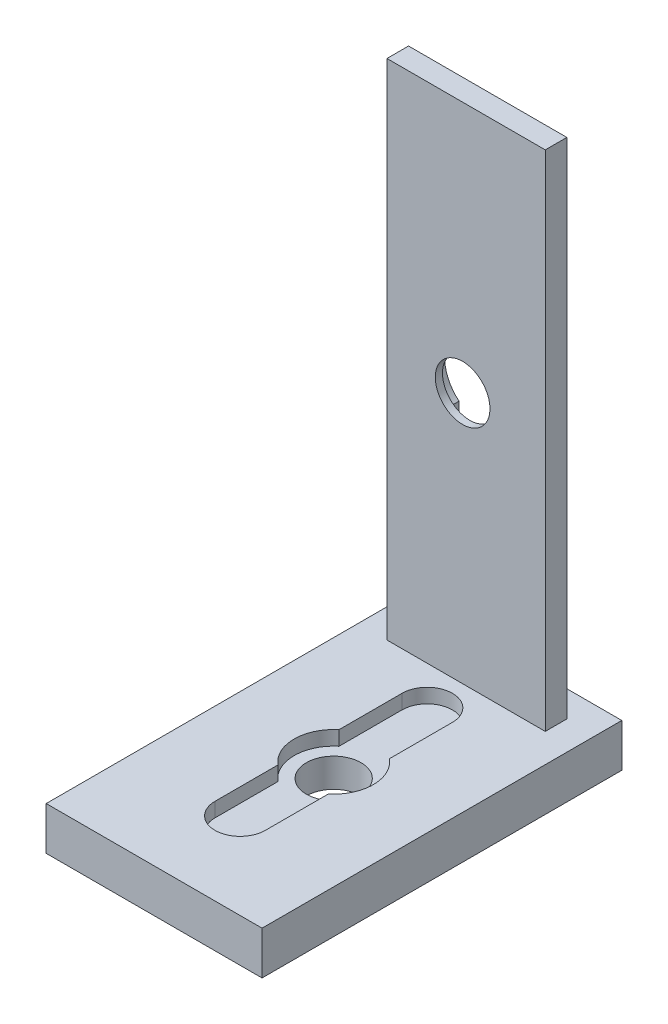
ISO-10303-21;
HEADER;
FILE_DESCRIPTION(('STEP AP214'),'2;1');
FILE_NAME('part.step','',(''),(''),'','','');
FILE_SCHEMA(('AUTOMOTIVE_DESIGN { 1 0 10303 214 1 1 1 1 }'));
ENDSEC;
DATA;
#1=APPLICATION_CONTEXT('core data for automotive mechanical design processes');
#2=APPLICATION_PROTOCOL_DEFINITION('international standard','automotive_design',2000,#1);
#3=PRODUCT_CONTEXT('',#1,'mechanical');
#4=PRODUCT('Part','Part','',(#3));
#5=PRODUCT_RELATED_PRODUCT_CATEGORY('part','',(#4));
#6=PRODUCT_DEFINITION_FORMATION('','',#4);
#7=PRODUCT_DEFINITION_CONTEXT('part definition',#1,'design');
#8=PRODUCT_DEFINITION('design','',#6,#7);
#9=PRODUCT_DEFINITION_SHAPE('','',#8);
#10=(LENGTH_UNIT() NAMED_UNIT(*) SI_UNIT(.MILLI.,.METRE.));
#11=(NAMED_UNIT(*) PLANE_ANGLE_UNIT() SI_UNIT($,.RADIAN.));
#12=(NAMED_UNIT(*) SI_UNIT($,.STERADIAN.) SOLID_ANGLE_UNIT());
#13=UNCERTAINTY_MEASURE_WITH_UNIT(LENGTH_MEASURE(1.E-05),#10,'distance_accuracy_value','');
#14=(GEOMETRIC_REPRESENTATION_CONTEXT(3) GLOBAL_UNCERTAINTY_ASSIGNED_CONTEXT((#13)) GLOBAL_UNIT_ASSIGNED_CONTEXT((#10,
#11,#12)) REPRESENTATION_CONTEXT('',''));
#15=CARTESIAN_POINT('',(0.,0.,0.));
#16=DIRECTION('',(0.,0.,1.));
#17=DIRECTION('',(1.,0.,0.));
#18=AXIS2_PLACEMENT_3D('',#15,#16,#17);
#19=CARTESIAN_POINT('',(0.,3.,0.));
#20=DIRECTION('',(0.,1.,0.));
#21=DIRECTION('',(0.,0.,1.));
#22=AXIS2_PLACEMENT_3D('',#19,#20,#21);
#23=PLANE('',#22);
#24=CARTESIAN_POINT('',(7.47928552156155,3.,6.));
#25=DIRECTION('',(0.,1.,0.));
#26=DIRECTION('',(0.,0.,1.));
#27=AXIS2_PLACEMENT_3D('',#24,#25,#26);
#28=CIRCLE('',#27,1.75);
#29=CARTESIAN_POINT('',(9.22928552156155,3.,6.));
#30=VERTEX_POINT('',#29);
#31=CARTESIAN_POINT('',(5.72928552156155,3.,6.));
#32=VERTEX_POINT('',#31);
#33=EDGE_CURVE('E300',#30,#32,#28,.T.);
#34=ORIENTED_EDGE('',*,*,#33,.F.);
#35=DIRECTION('',(0.,0.,-1.));
#36=VECTOR('',#35,1.);
#37=CARTESIAN_POINT('',(9.22928552156155,3.,6.));
#38=LINE('',#37,#36);
#39=CARTESIAN_POINT('',(9.22928552156155,3.,10.3786796564404));
#40=VERTEX_POINT('',#39);
#41=EDGE_CURVE('E307',#40,#30,#38,.T.);
#42=ORIENTED_EDGE('',*,*,#41,.F.);
#43=CARTESIAN_POINT('',(7.47928552156155,3.,12.5));
#44=DIRECTION('',(0.,1.,0.));
#45=DIRECTION('',(0.,0.,1.));
#46=AXIS2_PLACEMENT_3D('',#43,#44,#45);
#47=CIRCLE('',#46,2.75);
#48=CARTESIAN_POINT('',(9.22928552156155,3.,14.6213203435596));
#49=VERTEX_POINT('',#48);
#50=EDGE_CURVE('E345',#49,#40,#47,.T.);
#51=ORIENTED_EDGE('',*,*,#50,.F.);
#52=DIRECTION('',(0.,0.,-1.));
#53=VECTOR('',#52,1.);
#54=CARTESIAN_POINT('',(9.22928552156155,3.,14.6213203435596));
#55=LINE('',#54,#53);
#56=CARTESIAN_POINT('',(9.22928552156155,3.,19.));
#57=VERTEX_POINT('',#56);
#58=EDGE_CURVE('E342',#57,#49,#55,.T.);
#59=ORIENTED_EDGE('',*,*,#58,.F.);
#60=CARTESIAN_POINT('',(7.47928552156155,3.,19.));
#61=DIRECTION('',(0.,1.,0.));
#62=DIRECTION('',(0.,0.,1.));
#63=AXIS2_PLACEMENT_3D('',#60,#61,#62);
#64=CIRCLE('',#63,1.75);
#65=CARTESIAN_POINT('',(5.72928552156155,3.,19.));
#66=VERTEX_POINT('',#65);
#67=EDGE_CURVE('E339',#66,#57,#64,.T.);
#68=ORIENTED_EDGE('',*,*,#67,.F.);
#69=DIRECTION('',(0.,0.,1.));
#70=VECTOR('',#69,1.);
#71=CARTESIAN_POINT('',(5.72928552156155,3.,14.6213203435596));
#72=LINE('',#71,#70);
#73=CARTESIAN_POINT('',(5.72928552156155,3.,14.6213203435596));
#74=VERTEX_POINT('',#73);
#75=EDGE_CURVE('E336',#74,#66,#72,.T.);
#76=ORIENTED_EDGE('',*,*,#75,.F.);
#77=CARTESIAN_POINT('',(7.47928552156155,3.,12.5));
#78=DIRECTION('',(0.,1.,0.));
#79=DIRECTION('',(0.,0.,1.));
#80=AXIS2_PLACEMENT_3D('',#77,#78,#79);
#81=CIRCLE('',#80,2.75);
#82=CARTESIAN_POINT('',(5.72928552156155,3.,10.3786796564404));
#83=VERTEX_POINT('',#82);
#84=EDGE_CURVE('E333',#83,#74,#81,.T.);
#85=ORIENTED_EDGE('',*,*,#84,.F.);
#86=DIRECTION('',(0.,0.,1.));
#87=VECTOR('',#86,1.);
#88=CARTESIAN_POINT('',(5.72928552156155,3.,6.));
#89=LINE('',#88,#87);
#90=EDGE_CURVE('E330',#32,#83,#89,.T.);
#91=ORIENTED_EDGE('',*,*,#90,.F.);
#92=EDGE_LOOP('',(#34,#42,#51,#59,#68,#76,#85,#91));
#93=FACE_BOUND('',#92,.T.);
#94=DIRECTION('',(0.,0.,1.));
#95=VECTOR('',#94,1.);
#96=CARTESIAN_POINT('',(0.,3.,0.));
#97=LINE('',#96,#95);
#98=CARTESIAN_POINT('',(0.,3.,0.));
#99=VERTEX_POINT('',#98);
#100=CARTESIAN_POINT('',(0.,3.,25.));
#101=VERTEX_POINT('',#100);
#102=EDGE_CURVE('E367',#99,#101,#97,.T.);
#103=ORIENTED_EDGE('',*,*,#102,.T.);
#104=DIRECTION('',(1.,0.,0.));
#105=VECTOR('',#104,1.);
#106=CARTESIAN_POINT('',(0.,3.,25.));
#107=LINE('',#106,#105);
#108=CARTESIAN_POINT('',(15.,3.,25.));
#109=VERTEX_POINT('',#108);
#110=EDGE_CURVE('E370',#101,#109,#107,.T.);
#111=ORIENTED_EDGE('',*,*,#110,.T.);
#112=DIRECTION('',(0.,0.,-1.));
#113=VECTOR('',#112,1.);
#114=CARTESIAN_POINT('',(15.,3.,0.));
#115=LINE('',#114,#113);
#116=CARTESIAN_POINT('',(15.,3.,0.));
#117=VERTEX_POINT('',#116);
#118=EDGE_CURVE('E373',#109,#117,#115,.T.);
#119=ORIENTED_EDGE('',*,*,#118,.T.);
#120=DIRECTION('',(-1.,0.,0.));
#121=VECTOR('',#120,1.);
#122=CARTESIAN_POINT('',(0.,3.,0.));
#123=LINE('',#122,#121);
#124=EDGE_CURVE('E375',#117,#99,#123,.T.);
#125=ORIENTED_EDGE('',*,*,#124,.T.);
#126=EDGE_LOOP('',(#103,#111,#119,#125));
#127=FACE_BOUND('',#126,.T.);
#128=DIRECTION('',(-1.,0.,0.));
#129=VECTOR('',#128,1.);
#130=CARTESIAN_POINT('',(13.000545075607,3.,1.81990639272561));
#131=LINE('',#130,#129);
#132=CARTESIAN_POINT('',(13.000545075607,3.,1.81990639272561));
#133=VERTEX_POINT('',#132);
#134=CARTESIAN_POINT('',(2.,3.,1.81990639272561));
#135=VERTEX_POINT('',#134);
#136=EDGE_CURVE('E283',#133,#135,#131,.T.);
#137=ORIENTED_EDGE('',*,*,#136,.F.);
#138=DIRECTION('',(0.,0.,-1.));
#139=VECTOR('',#138,1.);
#140=CARTESIAN_POINT('',(13.000545075607,3.,1.81990639272561));
#141=LINE('',#140,#139);
#142=CARTESIAN_POINT('',(13.000545075607,3.,3.31990639272561));
#143=VERTEX_POINT('',#142);
#144=EDGE_CURVE('E258',#143,#133,#141,.T.);
#145=ORIENTED_EDGE('',*,*,#144,.F.);
#146=DIRECTION('',(1.,0.,0.));
#147=VECTOR('',#146,1.);
#148=CARTESIAN_POINT('',(13.000545075607,3.,3.31990639272561));
#149=LINE('',#148,#147);
#150=CARTESIAN_POINT('',(2.,3.,3.31990639272561));
#151=VERTEX_POINT('',#150);
#152=EDGE_CURVE('E274',#151,#143,#149,.T.);
#153=ORIENTED_EDGE('',*,*,#152,.F.);
#154=DIRECTION('',(0.,0.,1.));
#155=VECTOR('',#154,1.);
#156=CARTESIAN_POINT('',(2.,3.,1.81990639272561));
#157=LINE('',#156,#155);
#158=EDGE_CURVE('E285',#135,#151,#157,.T.);
#159=ORIENTED_EDGE('',*,*,#158,.F.);
#160=EDGE_LOOP('',(#137,#145,#153,#159));
#161=FACE_BOUND('',#160,.T.);
#162=ADVANCED_FACE('F34',(#93,#127,#161),#23,.T.);
#163=CARTESIAN_POINT('',(0.,3.,0.));
#164=DIRECTION('',(1.,0.,0.));
#165=DIRECTION('',(0.,0.,-1.));
#166=AXIS2_PLACEMENT_3D('',#163,#164,#165);
#167=PLANE('',#166);
#168=DIRECTION('',(0.,0.,1.));
#169=VECTOR('',#168,1.);
#170=CARTESIAN_POINT('',(0.,0.,0.));
#171=LINE('',#170,#169);
#172=CARTESIAN_POINT('',(0.,0.,0.));
#173=VERTEX_POINT('',#172);
#174=CARTESIAN_POINT('',(0.,0.,25.));
#175=VERTEX_POINT('',#174);
#176=EDGE_CURVE('E352',#173,#175,#171,.T.);
#177=ORIENTED_EDGE('',*,*,#176,.T.);
#178=DIRECTION('',(0.,-1.,0.));
#179=VECTOR('',#178,1.);
#180=CARTESIAN_POINT('',(0.,3.,25.));
#181=LINE('',#180,#179);
#182=EDGE_CURVE('E11',#101,#175,#181,.T.);
#183=ORIENTED_EDGE('',*,*,#182,.F.);
#184=ORIENTED_EDGE('',*,*,#102,.F.);
#185=DIRECTION('',(0.,-1.,0.));
#186=VECTOR('',#185,1.);
#187=CARTESIAN_POINT('',(0.,3.,0.));
#188=LINE('',#187,#186);
#189=EDGE_CURVE('E377',#99,#173,#188,.T.);
#190=ORIENTED_EDGE('',*,*,#189,.T.);
#191=EDGE_LOOP('',(#177,#183,#184,#190));
#192=FACE_BOUND('',#191,.T.);
#193=ADVANCED_FACE('F36',(#192),#167,.F.);
#194=CARTESIAN_POINT('',(0.,3.,25.));
#195=DIRECTION('',(0.,0.,-1.));
#196=DIRECTION('',(-1.,0.,0.));
#197=AXIS2_PLACEMENT_3D('',#194,#195,#196);
#198=PLANE('',#197);
#199=DIRECTION('',(1.,0.,0.));
#200=VECTOR('',#199,1.);
#201=CARTESIAN_POINT('',(0.,0.,25.));
#202=LINE('',#201,#200);
#203=CARTESIAN_POINT('',(15.,0.,25.));
#204=VERTEX_POINT('',#203);
#205=EDGE_CURVE('E380',#175,#204,#202,.T.);
#206=ORIENTED_EDGE('',*,*,#205,.T.);
#207=DIRECTION('',(0.,-1.,0.));
#208=VECTOR('',#207,1.);
#209=CARTESIAN_POINT('',(15.,3.,25.));
#210=LINE('',#209,#208);
#211=EDGE_CURVE('E42',#109,#204,#210,.T.);
#212=ORIENTED_EDGE('',*,*,#211,.F.);
#213=ORIENTED_EDGE('',*,*,#110,.F.);
#214=ORIENTED_EDGE('',*,*,#182,.T.);
#215=EDGE_LOOP('',(#206,#212,#213,#214));
#216=FACE_BOUND('',#215,.T.);
#217=ADVANCED_FACE('F410',(#216),#198,.F.);
#218=CARTESIAN_POINT('',(15.,3.,0.));
#219=DIRECTION('',(-1.,0.,0.));
#220=DIRECTION('',(0.,0.,1.));
#221=AXIS2_PLACEMENT_3D('',#218,#219,#220);
#222=PLANE('',#221);
#223=DIRECTION('',(0.,0.,-1.));
#224=VECTOR('',#223,1.);
#225=CARTESIAN_POINT('',(15.,0.,0.));
#226=LINE('',#225,#224);
#227=CARTESIAN_POINT('',(15.,0.,0.));
#228=VERTEX_POINT('',#227);
#229=EDGE_CURVE('E382',#204,#228,#226,.T.);
#230=ORIENTED_EDGE('',*,*,#229,.T.);
#231=DIRECTION('',(0.,-1.,0.));
#232=VECTOR('',#231,1.);
#233=CARTESIAN_POINT('',(15.,3.,0.));
#234=LINE('',#233,#232);
#235=EDGE_CURVE('E387',#117,#228,#234,.T.);
#236=ORIENTED_EDGE('',*,*,#235,.F.);
#237=ORIENTED_EDGE('',*,*,#118,.F.);
#238=ORIENTED_EDGE('',*,*,#211,.T.);
#239=EDGE_LOOP('',(#230,#236,#237,#238));
#240=FACE_BOUND('',#239,.T.);
#241=ADVANCED_FACE('F394',(#240),#222,.F.);
#242=CARTESIAN_POINT('',(0.,3.,0.));
#243=DIRECTION('',(0.,0.,1.));
#244=DIRECTION('',(1.,0.,0.));
#245=AXIS2_PLACEMENT_3D('',#242,#243,#244);
#246=PLANE('',#245);
#247=DIRECTION('',(-1.,0.,0.));
#248=VECTOR('',#247,1.);
#249=CARTESIAN_POINT('',(0.,0.,0.));
#250=LINE('',#249,#248);
#251=EDGE_CURVE('E371',#228,#173,#250,.T.);
#252=ORIENTED_EDGE('',*,*,#251,.T.);
#253=ORIENTED_EDGE('',*,*,#189,.F.);
#254=ORIENTED_EDGE('',*,*,#124,.F.);
#255=ORIENTED_EDGE('',*,*,#235,.T.);
#256=EDGE_LOOP('',(#252,#253,#254,#255));
#257=FACE_BOUND('',#256,.T.);
#258=ADVANCED_FACE('F403',(#257),#246,.F.);
#259=CARTESIAN_POINT('',(0.,0.,0.));
#260=DIRECTION('',(0.,1.,0.));
#261=DIRECTION('',(0.,0.,1.));
#262=AXIS2_PLACEMENT_3D('',#259,#260,#261);
#263=PLANE('',#262);
#264=CARTESIAN_POINT('',(7.47928552156155,0.,12.5));
#265=DIRECTION('',(0.,1.,0.));
#266=DIRECTION('',(0.,0.,1.));
#267=AXIS2_PLACEMENT_3D('',#264,#265,#266);
#268=CIRCLE('',#267,1.9);
#269=CARTESIAN_POINT('',(7.47928552156155,0.,14.4));
#270=VERTEX_POINT('',#269);
#271=EDGE_CURVE('E297',#270,#270,#268,.T.);
#272=ORIENTED_EDGE('',*,*,#271,.T.);
#273=EDGE_LOOP('',(#272));
#274=FACE_BOUND('',#273,.T.);
#275=ORIENTED_EDGE('',*,*,#176,.F.);
#276=ORIENTED_EDGE('',*,*,#251,.F.);
#277=ORIENTED_EDGE('',*,*,#229,.F.);
#278=ORIENTED_EDGE('',*,*,#205,.F.);
#279=EDGE_LOOP('',(#275,#276,#277,#278));
#280=FACE_BOUND('',#279,.T.);
#281=ADVANCED_FACE('F400',(#274,#280),#263,.F.);
#282=CARTESIAN_POINT('',(7.47928552156155,2.,6.));
#283=DIRECTION('',(0.,1.,0.));
#284=DIRECTION('',(0.,0.,1.));
#285=AXIS2_PLACEMENT_3D('',#282,#283,#284);
#286=CYLINDRICAL_SURFACE('',#285,1.75);
#287=ORIENTED_EDGE('',*,*,#33,.T.);
#288=DIRECTION('',(0.,1.,0.));
#289=VECTOR('',#288,1.);
#290=CARTESIAN_POINT('',(5.72928552156155,2.,6.));
#291=LINE('',#290,#289);
#292=CARTESIAN_POINT('',(5.72928552156155,2.,6.));
#293=VERTEX_POINT('',#292);
#294=EDGE_CURVE('E328',#293,#32,#291,.T.);
#295=ORIENTED_EDGE('',*,*,#294,.F.);
#296=CARTESIAN_POINT('',(7.47928552156155,2.,6.));
#297=DIRECTION('',(0.,1.,0.));
#298=DIRECTION('',(0.,0.,1.));
#299=AXIS2_PLACEMENT_3D('',#296,#297,#298);
#300=CIRCLE('',#299,1.75);
#301=CARTESIAN_POINT('',(9.22928552156155,2.,6.));
#302=VERTEX_POINT('',#301);
#303=EDGE_CURVE('E303',#302,#293,#300,.T.);
#304=ORIENTED_EDGE('',*,*,#303,.F.);
#305=DIRECTION('',(0.,1.,0.));
#306=VECTOR('',#305,1.);
#307=CARTESIAN_POINT('',(9.22928552156155,2.,6.));
#308=LINE('',#307,#306);
#309=EDGE_CURVE('E350',#302,#30,#308,.T.);
#310=ORIENTED_EDGE('',*,*,#309,.T.);
#311=EDGE_LOOP('',(#287,#295,#304,#310));
#312=FACE_BOUND('',#311,.T.);
#313=ADVANCED_FACE('F427',(#312),#286,.F.);
#314=CARTESIAN_POINT('',(9.22928552156155,2.,6.));
#315=DIRECTION('',(1.,0.,0.));
#316=DIRECTION('',(0.,0.,-1.));
#317=AXIS2_PLACEMENT_3D('',#314,#315,#316);
#318=PLANE('',#317);
#319=ORIENTED_EDGE('',*,*,#41,.T.);
#320=ORIENTED_EDGE('',*,*,#309,.F.);
#321=DIRECTION('',(0.,0.,-1.));
#322=VECTOR('',#321,1.);
#323=CARTESIAN_POINT('',(9.22928552156155,2.,6.));
#324=LINE('',#323,#322);
#325=CARTESIAN_POINT('',(9.22928552156155,2.,10.3786796564404));
#326=VERTEX_POINT('',#325);
#327=EDGE_CURVE('E325',#326,#302,#324,.T.);
#328=ORIENTED_EDGE('',*,*,#327,.F.);
#329=DIRECTION('',(0.,1.,0.));
#330=VECTOR('',#329,1.);
#331=CARTESIAN_POINT('',(9.22928552156155,2.,10.3786796564404));
#332=LINE('',#331,#330);
#333=EDGE_CURVE('E353',#326,#40,#332,.T.);
#334=ORIENTED_EDGE('',*,*,#333,.T.);
#335=EDGE_LOOP('',(#319,#320,#328,#334));
#336=FACE_BOUND('',#335,.T.);
#337=ADVANCED_FACE('F452',(#336),#318,.F.);
#338=CARTESIAN_POINT('',(7.47928552156155,2.,12.5));
#339=DIRECTION('',(0.,1.,0.));
#340=DIRECTION('',(0.,0.,1.));
#341=AXIS2_PLACEMENT_3D('',#338,#339,#340);
#342=CYLINDRICAL_SURFACE('',#341,2.75);
#343=ORIENTED_EDGE('',*,*,#50,.T.);
#344=ORIENTED_EDGE('',*,*,#333,.F.);
#345=CARTESIAN_POINT('',(7.47928552156155,2.,12.5));
#346=DIRECTION('',(0.,1.,0.));
#347=DIRECTION('',(0.,0.,1.));
#348=AXIS2_PLACEMENT_3D('',#345,#346,#347);
#349=CIRCLE('',#348,2.75);
#350=CARTESIAN_POINT('',(9.22928552156155,2.,14.6213203435596));
#351=VERTEX_POINT('',#350);
#352=EDGE_CURVE('E322',#351,#326,#349,.T.);
#353=ORIENTED_EDGE('',*,*,#352,.F.);
#354=DIRECTION('',(0.,1.,0.));
#355=VECTOR('',#354,1.);
#356=CARTESIAN_POINT('',(9.22928552156155,2.,14.6213203435596));
#357=LINE('',#356,#355);
#358=EDGE_CURVE('E355',#351,#49,#357,.T.);
#359=ORIENTED_EDGE('',*,*,#358,.T.);
#360=EDGE_LOOP('',(#343,#344,#353,#359));
#361=FACE_BOUND('',#360,.T.);
#362=ADVANCED_FACE('F458',(#361),#342,.F.);
#363=CARTESIAN_POINT('',(9.22928552156155,2.,14.6213203435596));
#364=DIRECTION('',(1.,0.,0.));
#365=DIRECTION('',(0.,0.,-1.));
#366=AXIS2_PLACEMENT_3D('',#363,#364,#365);
#367=PLANE('',#366);
#368=ORIENTED_EDGE('',*,*,#58,.T.);
#369=ORIENTED_EDGE('',*,*,#358,.F.);
#370=DIRECTION('',(0.,0.,-1.));
#371=VECTOR('',#370,1.);
#372=CARTESIAN_POINT('',(9.22928552156155,2.,14.6213203435596));
#373=LINE('',#372,#371);
#374=CARTESIAN_POINT('',(9.22928552156155,2.,19.));
#375=VERTEX_POINT('',#374);
#376=EDGE_CURVE('E319',#375,#351,#373,.T.);
#377=ORIENTED_EDGE('',*,*,#376,.F.);
#378=DIRECTION('',(0.,1.,0.));
#379=VECTOR('',#378,1.);
#380=CARTESIAN_POINT('',(9.22928552156155,2.,19.));
#381=LINE('',#380,#379);
#382=EDGE_CURVE('E357',#375,#57,#381,.T.);
#383=ORIENTED_EDGE('',*,*,#382,.T.);
#384=EDGE_LOOP('',(#368,#369,#377,#383));
#385=FACE_BOUND('',#384,.T.);
#386=ADVANCED_FACE('F466',(#385),#367,.F.);
#387=CARTESIAN_POINT('',(7.47928552156155,2.,19.));
#388=DIRECTION('',(0.,1.,0.));
#389=DIRECTION('',(0.,0.,1.));
#390=AXIS2_PLACEMENT_3D('',#387,#388,#389);
#391=CYLINDRICAL_SURFACE('',#390,1.75);
#392=ORIENTED_EDGE('',*,*,#67,.T.);
#393=ORIENTED_EDGE('',*,*,#382,.F.);
#394=CARTESIAN_POINT('',(7.47928552156155,2.,19.));
#395=DIRECTION('',(0.,1.,0.));
#396=DIRECTION('',(0.,0.,1.));
#397=AXIS2_PLACEMENT_3D('',#394,#395,#396);
#398=CIRCLE('',#397,1.75);
#399=CARTESIAN_POINT('',(5.72928552156155,2.,19.));
#400=VERTEX_POINT('',#399);
#401=EDGE_CURVE('E316',#400,#375,#398,.T.);
#402=ORIENTED_EDGE('',*,*,#401,.F.);
#403=DIRECTION('',(0.,1.,0.));
#404=VECTOR('',#403,1.);
#405=CARTESIAN_POINT('',(5.72928552156155,2.,19.));
#406=LINE('',#405,#404);
#407=EDGE_CURVE('E359',#400,#66,#406,.T.);
#408=ORIENTED_EDGE('',*,*,#407,.T.);
#409=EDGE_LOOP('',(#392,#393,#402,#408));
#410=FACE_BOUND('',#409,.T.);
#411=ADVANCED_FACE('F474',(#410),#391,.F.);
#412=CARTESIAN_POINT('',(5.72928552156155,2.,14.6213203435596));
#413=DIRECTION('',(-1.,0.,0.));
#414=DIRECTION('',(0.,0.,1.));
#415=AXIS2_PLACEMENT_3D('',#412,#413,#414);
#416=PLANE('',#415);
#417=ORIENTED_EDGE('',*,*,#75,.T.);
#418=ORIENTED_EDGE('',*,*,#407,.F.);
#419=DIRECTION('',(0.,0.,1.));
#420=VECTOR('',#419,1.);
#421=CARTESIAN_POINT('',(5.72928552156155,2.,14.6213203435596));
#422=LINE('',#421,#420);
#423=CARTESIAN_POINT('',(5.72928552156155,2.,14.6213203435596));
#424=VERTEX_POINT('',#423);
#425=EDGE_CURVE('E313',#424,#400,#422,.T.);
#426=ORIENTED_EDGE('',*,*,#425,.F.);
#427=DIRECTION('',(0.,1.,0.));
#428=VECTOR('',#427,1.);
#429=CARTESIAN_POINT('',(5.72928552156155,2.,14.6213203435596));
#430=LINE('',#429,#428);
#431=EDGE_CURVE('E361',#424,#74,#430,.T.);
#432=ORIENTED_EDGE('',*,*,#431,.T.);
#433=EDGE_LOOP('',(#417,#418,#426,#432));
#434=FACE_BOUND('',#433,.T.);
#435=ADVANCED_FACE('F482',(#434),#416,.F.);
#436=CARTESIAN_POINT('',(7.47928552156155,2.,12.5));
#437=DIRECTION('',(0.,1.,0.));
#438=DIRECTION('',(0.,0.,1.));
#439=AXIS2_PLACEMENT_3D('',#436,#437,#438);
#440=CYLINDRICAL_SURFACE('',#439,2.75);
#441=ORIENTED_EDGE('',*,*,#84,.T.);
#442=ORIENTED_EDGE('',*,*,#431,.F.);
#443=CARTESIAN_POINT('',(7.47928552156155,2.,12.5));
#444=DIRECTION('',(0.,1.,0.));
#445=DIRECTION('',(0.,0.,1.));
#446=AXIS2_PLACEMENT_3D('',#443,#444,#445);
#447=CIRCLE('',#446,2.75);
#448=CARTESIAN_POINT('',(5.72928552156155,2.,10.3786796564404));
#449=VERTEX_POINT('',#448);
#450=EDGE_CURVE('E310',#449,#424,#447,.T.);
#451=ORIENTED_EDGE('',*,*,#450,.F.);
#452=DIRECTION('',(0.,1.,0.));
#453=VECTOR('',#452,1.);
#454=CARTESIAN_POINT('',(5.72928552156155,2.,10.3786796564404));
#455=LINE('',#454,#453);
#456=EDGE_CURVE('E363',#449,#83,#455,.T.);
#457=ORIENTED_EDGE('',*,*,#456,.T.);
#458=EDGE_LOOP('',(#441,#442,#451,#457));
#459=FACE_BOUND('',#458,.T.);
#460=ADVANCED_FACE('F490',(#459),#440,.F.);
#461=CARTESIAN_POINT('',(5.72928552156155,2.,6.));
#462=DIRECTION('',(-1.,0.,0.));
#463=DIRECTION('',(0.,0.,1.));
#464=AXIS2_PLACEMENT_3D('',#461,#462,#463);
#465=PLANE('',#464);
#466=ORIENTED_EDGE('',*,*,#90,.T.);
#467=ORIENTED_EDGE('',*,*,#456,.F.);
#468=DIRECTION('',(0.,0.,1.));
#469=VECTOR('',#468,1.);
#470=CARTESIAN_POINT('',(5.72928552156155,2.,6.));
#471=LINE('',#470,#469);
#472=EDGE_CURVE('E306',#293,#449,#471,.T.);
#473=ORIENTED_EDGE('',*,*,#472,.F.);
#474=ORIENTED_EDGE('',*,*,#294,.T.);
#475=EDGE_LOOP('',(#466,#467,#473,#474));
#476=FACE_BOUND('',#475,.T.);
#477=ADVANCED_FACE('F498',(#476),#465,.F.);
#478=CARTESIAN_POINT('',(7.47928552156155,2.,6.));
#479=DIRECTION('',(0.,1.,0.));
#480=DIRECTION('',(0.,0.,1.));
#481=AXIS2_PLACEMENT_3D('',#478,#479,#480);
#482=PLANE('',#481);
#483=CARTESIAN_POINT('',(7.47928552156155,2.,12.5));
#484=DIRECTION('',(0.,1.,0.));
#485=DIRECTION('',(0.,0.,1.));
#486=AXIS2_PLACEMENT_3D('',#483,#484,#485);
#487=CIRCLE('',#486,1.9);
#488=CARTESIAN_POINT('',(7.47928552156155,2.,14.4));
#489=VERTEX_POINT('',#488);
#490=EDGE_CURVE('E296',#489,#489,#487,.T.);
#491=ORIENTED_EDGE('',*,*,#490,.F.);
#492=EDGE_LOOP('',(#491));
#493=FACE_BOUND('',#492,.T.);
#494=ORIENTED_EDGE('',*,*,#303,.T.);
#495=ORIENTED_EDGE('',*,*,#472,.T.);
#496=ORIENTED_EDGE('',*,*,#450,.T.);
#497=ORIENTED_EDGE('',*,*,#425,.T.);
#498=ORIENTED_EDGE('',*,*,#401,.T.);
#499=ORIENTED_EDGE('',*,*,#376,.T.);
#500=ORIENTED_EDGE('',*,*,#352,.T.);
#501=ORIENTED_EDGE('',*,*,#327,.T.);
#502=EDGE_LOOP('',(#494,#495,#496,#497,#498,#499,#500,#501));
#503=FACE_BOUND('',#502,.T.);
#504=ADVANCED_FACE('F505',(#493,#503),#482,.T.);
#505=CARTESIAN_POINT('',(7.47928552156155,0.,12.5));
#506=DIRECTION('',(0.,1.,0.));
#507=DIRECTION('',(0.,0.,1.));
#508=AXIS2_PLACEMENT_3D('',#505,#506,#507);
#509=CYLINDRICAL_SURFACE('',#508,1.9);
#510=ORIENTED_EDGE('',*,*,#271,.F.);
#511=EDGE_LOOP('',(#510));
#512=FACE_BOUND('',#511,.T.);
#513=ORIENTED_EDGE('',*,*,#490,.T.);
#514=EDGE_LOOP('',(#513));
#515=FACE_BOUND('',#514,.T.);
#516=ADVANCED_FACE('F512',(#512,#515),#509,.F.);
#517=CARTESIAN_POINT('',(13.000545075607,38.,1.81990639272561));
#518=DIRECTION('',(-1.,0.,0.));
#519=DIRECTION('',(0.,0.,1.));
#520=AXIS2_PLACEMENT_3D('',#517,#518,#519);
#521=PLANE('',#520);
#522=ORIENTED_EDGE('',*,*,#144,.T.);
#523=DIRECTION('',(0.,-1.,0.));
#524=VECTOR('',#523,1.);
#525=CARTESIAN_POINT('',(13.000545075607,38.,1.81990639272561));
#526=LINE('',#525,#524);
#527=CARTESIAN_POINT('',(13.000545075607,38.,1.81990639272561));
#528=VERTEX_POINT('',#527);
#529=EDGE_CURVE('E294',#528,#133,#526,.T.);
#530=ORIENTED_EDGE('',*,*,#529,.F.);
#531=DIRECTION('',(0.,0.,-1.));
#532=VECTOR('',#531,1.);
#533=CARTESIAN_POINT('',(13.000545075607,38.,1.81990639272561));
#534=LINE('',#533,#532);
#535=CARTESIAN_POINT('',(13.000545075607,38.,3.31990639272561));
#536=VERTEX_POINT('',#535);
#537=EDGE_CURVE('E270',#536,#528,#534,.T.);
#538=ORIENTED_EDGE('',*,*,#537,.F.);
#539=DIRECTION('',(0.,-1.,0.));
#540=VECTOR('',#539,1.);
#541=CARTESIAN_POINT('',(13.000545075607,38.,3.31990639272561));
#542=LINE('',#541,#540);
#543=EDGE_CURVE('E280',#536,#143,#542,.T.);
#544=ORIENTED_EDGE('',*,*,#543,.T.);
#545=EDGE_LOOP('',(#522,#530,#538,#544));
#546=FACE_BOUND('',#545,.T.);
#547=ADVANCED_FACE('F521',(#546),#521,.F.);
#548=CARTESIAN_POINT('',(13.000545075607,38.,1.81990639272561));
#549=DIRECTION('',(0.,0.,1.));
#550=DIRECTION('',(1.,0.,0.));
#551=AXIS2_PLACEMENT_3D('',#548,#549,#550);
#552=PLANE('',#551);
#553=DIRECTION('',(0.,1.,0.));
#554=VECTOR('',#553,1.);
#555=CARTESIAN_POINT('',(5.50877590438644,14.,1.81990639272561));
#556=LINE('',#555,#554);
#557=CARTESIAN_POINT('',(5.50877590438644,14.,1.81990639272561));
#558=VERTEX_POINT('',#557);
#559=CARTESIAN_POINT('',(5.50877590438644,18.3786796564404,1.81990639272561));
#560=VERTEX_POINT('',#559);
#561=EDGE_CURVE('E240',#558,#560,#556,.T.);
#562=ORIENTED_EDGE('',*,*,#561,.F.);
#563=CARTESIAN_POINT('',(7.25877590438644,14.,1.81990639272561));
#564=DIRECTION('',(0.,0.,-1.));
#565=DIRECTION('',(-1.,0.,0.));
#566=AXIS2_PLACEMENT_3D('',#563,#564,#565);
#567=CIRCLE('',#566,1.75);
#568=CARTESIAN_POINT('',(9.00877590438644,14.,1.81990639272561));
#569=VERTEX_POINT('',#568);
#570=EDGE_CURVE('E49',#569,#558,#567,.T.);
#571=ORIENTED_EDGE('',*,*,#570,.F.);
#572=DIRECTION('',(0.,-1.,0.));
#573=VECTOR('',#572,1.);
#574=CARTESIAN_POINT('',(9.00877590438644,14.,1.81990639272561));
#575=LINE('',#574,#573);
#576=CARTESIAN_POINT('',(9.00877590438644,18.3786796564404,1.81990639272561));
#577=VERTEX_POINT('',#576);
#578=EDGE_CURVE('E217',#577,#569,#575,.T.);
#579=ORIENTED_EDGE('',*,*,#578,.F.);
#580=CARTESIAN_POINT('',(7.25877590438644,20.5,1.81990639272561));
#581=DIRECTION('',(0.,0.,-1.));
#582=DIRECTION('',(-1.,0.,0.));
#583=AXIS2_PLACEMENT_3D('',#580,#581,#582);
#584=CIRCLE('',#583,2.75);
#585=CARTESIAN_POINT('',(9.00877590438644,22.6213203435596,1.81990639272561));
#586=VERTEX_POINT('',#585);
#587=EDGE_CURVE('E220',#586,#577,#584,.T.);
#588=ORIENTED_EDGE('',*,*,#587,.F.);
#589=DIRECTION('',(0.,-1.,0.));
#590=VECTOR('',#589,1.);
#591=CARTESIAN_POINT('',(9.00877590438644,22.6213203435596,1.81990639272561));
#592=LINE('',#591,#590);
#593=CARTESIAN_POINT('',(9.00877590438644,27.,1.81990639272561));
#594=VERTEX_POINT('',#593);
#595=EDGE_CURVE('E251',#594,#586,#592,.T.);
#596=ORIENTED_EDGE('',*,*,#595,.F.);
#597=CARTESIAN_POINT('',(7.25877590438644,27.,1.81990639272561));
#598=DIRECTION('',(0.,0.,-1.));
#599=DIRECTION('',(-1.,0.,0.));
#600=AXIS2_PLACEMENT_3D('',#597,#598,#599);
#601=CIRCLE('',#600,1.75);
#602=CARTESIAN_POINT('',(5.50877590438644,27.,1.81990639272561));
#603=VERTEX_POINT('',#602);
#604=EDGE_CURVE('E248',#603,#594,#601,.T.);
#605=ORIENTED_EDGE('',*,*,#604,.F.);
#606=DIRECTION('',(0.,1.,0.));
#607=VECTOR('',#606,1.);
#608=CARTESIAN_POINT('',(5.50877590438644,22.6213203435596,1.81990639272561));
#609=LINE('',#608,#607);
#610=CARTESIAN_POINT('',(5.50877590438644,22.6213203435596,1.81990639272561));
#611=VERTEX_POINT('',#610);
#612=EDGE_CURVE('E245',#611,#603,#609,.T.);
#613=ORIENTED_EDGE('',*,*,#612,.F.);
#614=CARTESIAN_POINT('',(7.25877590438644,20.5,1.81990639272561));
#615=DIRECTION('',(0.,0.,-1.));
#616=DIRECTION('',(-1.,0.,0.));
#617=AXIS2_PLACEMENT_3D('',#614,#615,#616);
#618=CIRCLE('',#617,2.75);
#619=EDGE_CURVE('E242',#560,#611,#618,.T.);
#620=ORIENTED_EDGE('',*,*,#619,.F.);
#621=EDGE_LOOP('',(#562,#571,#579,#588,#596,#605,#613,#620));
#622=FACE_BOUND('',#621,.T.);
#623=ORIENTED_EDGE('',*,*,#136,.T.);
#624=DIRECTION('',(0.,-1.,0.));
#625=VECTOR('',#624,1.);
#626=CARTESIAN_POINT('',(2.,38.,1.81990639272561));
#627=LINE('',#626,#625);
#628=CARTESIAN_POINT('',(2.,38.,1.81990639272561));
#629=VERTEX_POINT('',#628);
#630=EDGE_CURVE('E291',#629,#135,#627,.T.);
#631=ORIENTED_EDGE('',*,*,#630,.F.);
#632=DIRECTION('',(-1.,0.,0.));
#633=VECTOR('',#632,1.);
#634=CARTESIAN_POINT('',(13.000545075607,38.,1.81990639272561));
#635=LINE('',#634,#633);
#636=EDGE_CURVE('E273',#528,#629,#635,.T.);
#637=ORIENTED_EDGE('',*,*,#636,.F.);
#638=ORIENTED_EDGE('',*,*,#529,.T.);
#639=EDGE_LOOP('',(#623,#631,#637,#638));
#640=FACE_BOUND('',#639,.T.);
#641=ADVANCED_FACE('F532',(#622,#640),#552,.F.);
#642=CARTESIAN_POINT('',(2.,38.,1.81990639272561));
#643=DIRECTION('',(1.,0.,0.));
#644=DIRECTION('',(0.,0.,-1.));
#645=AXIS2_PLACEMENT_3D('',#642,#643,#644);
#646=PLANE('',#645);
#647=ORIENTED_EDGE('',*,*,#158,.T.);
#648=DIRECTION('',(0.,-1.,0.));
#649=VECTOR('',#648,1.);
#650=CARTESIAN_POINT('',(2.,38.,3.31990639272561));
#651=LINE('',#650,#649);
#652=CARTESIAN_POINT('',(2.,38.,3.31990639272561));
#653=VERTEX_POINT('',#652);
#654=EDGE_CURVE('E57',#653,#151,#651,.T.);
#655=ORIENTED_EDGE('',*,*,#654,.F.);
#656=DIRECTION('',(0.,0.,1.));
#657=VECTOR('',#656,1.);
#658=CARTESIAN_POINT('',(2.,38.,1.81990639272561));
#659=LINE('',#658,#657);
#660=EDGE_CURVE('E276',#629,#653,#659,.T.);
#661=ORIENTED_EDGE('',*,*,#660,.F.);
#662=ORIENTED_EDGE('',*,*,#630,.T.);
#663=EDGE_LOOP('',(#647,#655,#661,#662));
#664=FACE_BOUND('',#663,.T.);
#665=ADVANCED_FACE('F540',(#664),#646,.F.);
#666=CARTESIAN_POINT('',(13.000545075607,38.,3.31990639272561));
#667=DIRECTION('',(0.,0.,-1.));
#668=DIRECTION('',(-1.,0.,0.));
#669=AXIS2_PLACEMENT_3D('',#666,#667,#668);
#670=PLANE('',#669);
#671=CARTESIAN_POINT('',(7.25877590438644,20.5,3.31990639272561));
#672=DIRECTION('',(0.,0.,-1.));
#673=DIRECTION('',(-1.,0.,0.));
#674=AXIS2_PLACEMENT_3D('',#671,#672,#673);
#675=CIRCLE('',#674,1.9);
#676=CARTESIAN_POINT('',(5.35877590438644,20.5,3.31990639272561));
#677=VERTEX_POINT('',#676);
#678=EDGE_CURVE('E223',#677,#677,#675,.T.);
#679=ORIENTED_EDGE('',*,*,#678,.T.);
#680=EDGE_LOOP('',(#679));
#681=FACE_BOUND('',#680,.T.);
#682=ORIENTED_EDGE('',*,*,#152,.T.);
#683=ORIENTED_EDGE('',*,*,#543,.F.);
#684=DIRECTION('',(1.,0.,0.));
#685=VECTOR('',#684,1.);
#686=CARTESIAN_POINT('',(13.000545075607,38.,3.31990639272561));
#687=LINE('',#686,#685);
#688=EDGE_CURVE('E278',#653,#536,#687,.T.);
#689=ORIENTED_EDGE('',*,*,#688,.F.);
#690=ORIENTED_EDGE('',*,*,#654,.T.);
#691=EDGE_LOOP('',(#682,#683,#689,#690));
#692=FACE_BOUND('',#691,.T.);
#693=ADVANCED_FACE('F549',(#681,#692),#670,.F.);
#694=CARTESIAN_POINT('',(0.,38.,0.));
#695=DIRECTION('',(0.,-1.,0.));
#696=DIRECTION('',(0.,0.,-1.));
#697=AXIS2_PLACEMENT_3D('',#694,#695,#696);
#698=PLANE('',#697);
#699=ORIENTED_EDGE('',*,*,#537,.T.);
#700=ORIENTED_EDGE('',*,*,#636,.T.);
#701=ORIENTED_EDGE('',*,*,#660,.T.);
#702=ORIENTED_EDGE('',*,*,#688,.T.);
#703=EDGE_LOOP('',(#699,#700,#701,#702));
#704=FACE_BOUND('',#703,.T.);
#705=ADVANCED_FACE('F558',(#704),#698,.F.);
#706=CARTESIAN_POINT('',(7.25877590438644,14.,2.81990639272561));
#707=DIRECTION('',(0.,0.,-1.));
#708=DIRECTION('',(-1.,0.,0.));
#709=AXIS2_PLACEMENT_3D('',#706,#707,#708);
#710=CYLINDRICAL_SURFACE('',#709,1.75);
#711=ORIENTED_EDGE('',*,*,#570,.T.);
#712=DIRECTION('',(0.,0.,-1.));
#713=VECTOR('',#712,1.);
#714=CARTESIAN_POINT('',(5.50877590438644,14.,2.81990639272561));
#715=LINE('',#714,#713);
#716=CARTESIAN_POINT('',(5.50877590438644,14.,2.81990639272561));
#717=VERTEX_POINT('',#716);
#718=EDGE_CURVE('E194',#717,#558,#715,.T.);
#719=ORIENTED_EDGE('',*,*,#718,.F.);
#720=CARTESIAN_POINT('',(7.25877590438644,14.,2.81990639272561));
#721=DIRECTION('',(0.,0.,-1.));
#722=DIRECTION('',(-1.,0.,0.));
#723=AXIS2_PLACEMENT_3D('',#720,#721,#722);
#724=CIRCLE('',#723,1.75);
#725=CARTESIAN_POINT('',(9.00877590438644,14.,2.81990639272561));
#726=VERTEX_POINT('',#725);
#727=EDGE_CURVE('E198',#726,#717,#724,.T.);
#728=ORIENTED_EDGE('',*,*,#727,.F.);
#729=DIRECTION('',(0.,0.,-1.));
#730=VECTOR('',#729,1.);
#731=CARTESIAN_POINT('',(9.00877590438644,14.,2.81990639272561));
#732=LINE('',#731,#730);
#733=EDGE_CURVE('E256',#726,#569,#732,.T.);
#734=ORIENTED_EDGE('',*,*,#733,.T.);
#735=EDGE_LOOP('',(#711,#719,#728,#734));
#736=FACE_BOUND('',#735,.T.);
#737=ADVANCED_FACE('F196',(#736),#710,.F.);
#738=CARTESIAN_POINT('',(9.00877590438644,14.,2.81990639272561));
#739=DIRECTION('',(1.,0.,0.));
#740=DIRECTION('',(0.,0.,-1.));
#741=AXIS2_PLACEMENT_3D('',#738,#739,#740);
#742=PLANE('',#741);
#743=ORIENTED_EDGE('',*,*,#578,.T.);
#744=ORIENTED_EDGE('',*,*,#733,.F.);
#745=DIRECTION('',(0.,-1.,0.));
#746=VECTOR('',#745,1.);
#747=CARTESIAN_POINT('',(9.00877590438644,14.,2.81990639272561));
#748=LINE('',#747,#746);
#749=CARTESIAN_POINT('',(9.00877590438644,18.3786796564404,2.81990639272561));
#750=VERTEX_POINT('',#749);
#751=EDGE_CURVE('E204',#750,#726,#748,.T.);
#752=ORIENTED_EDGE('',*,*,#751,.F.);
#753=DIRECTION('',(0.,0.,-1.));
#754=VECTOR('',#753,1.);
#755=CARTESIAN_POINT('',(9.00877590438644,18.3786796564404,2.81990639272561));
#756=LINE('',#755,#754);
#757=EDGE_CURVE('E259',#750,#577,#756,.T.);
#758=ORIENTED_EDGE('',*,*,#757,.T.);
#759=EDGE_LOOP('',(#743,#744,#752,#758));
#760=FACE_BOUND('',#759,.T.);
#761=ADVANCED_FACE('F574',(#760),#742,.F.);
#762=CARTESIAN_POINT('',(7.25877590438644,20.5,2.81990639272561));
#763=DIRECTION('',(0.,0.,-1.));
#764=DIRECTION('',(-1.,0.,0.));
#765=AXIS2_PLACEMENT_3D('',#762,#763,#764);
#766=CYLINDRICAL_SURFACE('',#765,2.75);
#767=ORIENTED_EDGE('',*,*,#587,.T.);
#768=ORIENTED_EDGE('',*,*,#757,.F.);
#769=CARTESIAN_POINT('',(7.25877590438644,20.5,2.81990639272561));
#770=DIRECTION('',(0.,0.,-1.));
#771=DIRECTION('',(-1.,0.,0.));
#772=AXIS2_PLACEMENT_3D('',#769,#770,#771);
#773=CIRCLE('',#772,2.75);
#774=CARTESIAN_POINT('',(9.00877590438644,22.6213203435596,2.81990639272561));
#775=VERTEX_POINT('',#774);
#776=EDGE_CURVE('E236',#775,#750,#773,.T.);
#777=ORIENTED_EDGE('',*,*,#776,.F.);
#778=DIRECTION('',(0.,0.,-1.));
#779=VECTOR('',#778,1.);
#780=CARTESIAN_POINT('',(9.00877590438644,22.6213203435596,2.81990639272561));
#781=LINE('',#780,#779);
#782=EDGE_CURVE('E261',#775,#586,#781,.T.);
#783=ORIENTED_EDGE('',*,*,#782,.T.);
#784=EDGE_LOOP('',(#767,#768,#777,#783));
#785=FACE_BOUND('',#784,.T.);
#786=ADVANCED_FACE('F581',(#785),#766,.F.);
#787=CARTESIAN_POINT('',(9.00877590438644,22.6213203435596,2.81990639272561));
#788=DIRECTION('',(1.,0.,0.));
#789=DIRECTION('',(0.,0.,-1.));
#790=AXIS2_PLACEMENT_3D('',#787,#788,#789);
#791=PLANE('',#790);
#792=ORIENTED_EDGE('',*,*,#595,.T.);
#793=ORIENTED_EDGE('',*,*,#782,.F.);
#794=DIRECTION('',(0.,-1.,0.));
#795=VECTOR('',#794,1.);
#796=CARTESIAN_POINT('',(9.00877590438644,22.6213203435596,2.81990639272561));
#797=LINE('',#796,#795);
#798=CARTESIAN_POINT('',(9.00877590438644,27.,2.81990639272561));
#799=VERTEX_POINT('',#798);
#800=EDGE_CURVE('E233',#799,#775,#797,.T.);
#801=ORIENTED_EDGE('',*,*,#800,.F.);
#802=DIRECTION('',(0.,0.,-1.));
#803=VECTOR('',#802,1.);
#804=CARTESIAN_POINT('',(9.00877590438644,27.,2.81990639272561));
#805=LINE('',#804,#803);
#806=EDGE_CURVE('E263',#799,#594,#805,.T.);
#807=ORIENTED_EDGE('',*,*,#806,.T.);
#808=EDGE_LOOP('',(#792,#793,#801,#807));
#809=FACE_BOUND('',#808,.T.);
#810=ADVANCED_FACE('F589',(#809),#791,.F.);
#811=CARTESIAN_POINT('',(7.25877590438644,27.,2.81990639272561));
#812=DIRECTION('',(0.,0.,-1.));
#813=DIRECTION('',(-1.,0.,0.));
#814=AXIS2_PLACEMENT_3D('',#811,#812,#813);
#815=CYLINDRICAL_SURFACE('',#814,1.75);
#816=ORIENTED_EDGE('',*,*,#604,.T.);
#817=ORIENTED_EDGE('',*,*,#806,.F.);
#818=CARTESIAN_POINT('',(7.25877590438644,27.,2.81990639272561));
#819=DIRECTION('',(0.,0.,-1.));
#820=DIRECTION('',(-1.,0.,0.));
#821=AXIS2_PLACEMENT_3D('',#818,#819,#820);
#822=CIRCLE('',#821,1.75);
#823=CARTESIAN_POINT('',(5.50877590438644,27.,2.81990639272561));
#824=VERTEX_POINT('',#823);
#825=EDGE_CURVE('E230',#824,#799,#822,.T.);
#826=ORIENTED_EDGE('',*,*,#825,.F.);
#827=DIRECTION('',(0.,0.,-1.));
#828=VECTOR('',#827,1.);
#829=CARTESIAN_POINT('',(5.50877590438644,27.,2.81990639272561));
#830=LINE('',#829,#828);
#831=EDGE_CURVE('E265',#824,#603,#830,.T.);
#832=ORIENTED_EDGE('',*,*,#831,.T.);
#833=EDGE_LOOP('',(#816,#817,#826,#832));
#834=FACE_BOUND('',#833,.T.);
#835=ADVANCED_FACE('F597',(#834),#815,.F.);
#836=CARTESIAN_POINT('',(5.50877590438644,22.6213203435596,2.81990639272561));
#837=DIRECTION('',(-1.,0.,0.));
#838=DIRECTION('',(0.,-1.,0.));
#839=AXIS2_PLACEMENT_3D('',#836,#837,#838);
#840=PLANE('',#839);
#841=ORIENTED_EDGE('',*,*,#612,.T.);
#842=ORIENTED_EDGE('',*,*,#831,.F.);
#843=DIRECTION('',(0.,1.,0.));
#844=VECTOR('',#843,1.);
#845=CARTESIAN_POINT('',(5.50877590438644,22.6213203435596,2.81990639272561));
#846=LINE('',#845,#844);
#847=CARTESIAN_POINT('',(5.50877590438644,22.6213203435596,2.81990639272561));
#848=VERTEX_POINT('',#847);
#849=EDGE_CURVE('E227',#848,#824,#846,.T.);
#850=ORIENTED_EDGE('',*,*,#849,.F.);
#851=DIRECTION('',(0.,0.,-1.));
#852=VECTOR('',#851,1.);
#853=CARTESIAN_POINT('',(5.50877590438644,22.6213203435596,2.81990639272561));
#854=LINE('',#853,#852);
#855=EDGE_CURVE('E267',#848,#611,#854,.T.);
#856=ORIENTED_EDGE('',*,*,#855,.T.);
#857=EDGE_LOOP('',(#841,#842,#850,#856));
#858=FACE_BOUND('',#857,.T.);
#859=ADVANCED_FACE('F605',(#858),#840,.F.);
#860=CARTESIAN_POINT('',(7.25877590438644,20.5,2.81990639272561));
#861=DIRECTION('',(0.,0.,-1.));
#862=DIRECTION('',(-1.,0.,0.));
#863=AXIS2_PLACEMENT_3D('',#860,#861,#862);
#864=CYLINDRICAL_SURFACE('',#863,2.75);
#865=ORIENTED_EDGE('',*,*,#619,.T.);
#866=ORIENTED_EDGE('',*,*,#855,.F.);
#867=CARTESIAN_POINT('',(7.25877590438644,20.5,2.81990639272561));
#868=DIRECTION('',(0.,0.,-1.));
#869=DIRECTION('',(-1.,0.,0.));
#870=AXIS2_PLACEMENT_3D('',#867,#868,#869);
#871=CIRCLE('',#870,2.75);
#872=CARTESIAN_POINT('',(5.50877590438644,18.3786796564404,2.81990639272561));
#873=VERTEX_POINT('',#872);
#874=EDGE_CURVE('E212',#873,#848,#871,.T.);
#875=ORIENTED_EDGE('',*,*,#874,.F.);
#876=DIRECTION('',(0.,0.,-1.));
#877=VECTOR('',#876,1.);
#878=CARTESIAN_POINT('',(5.50877590438644,18.3786796564404,2.81990639272561));
#879=LINE('',#878,#877);
#880=EDGE_CURVE('E203',#873,#560,#879,.T.);
#881=ORIENTED_EDGE('',*,*,#880,.T.);
#882=EDGE_LOOP('',(#865,#866,#875,#881));
#883=FACE_BOUND('',#882,.T.);
#884=ADVANCED_FACE('F613',(#883),#864,.F.);
#885=CARTESIAN_POINT('',(5.50877590438644,14.,2.81990639272561));
#886=DIRECTION('',(-1.,0.,0.));
#887=DIRECTION('',(0.,0.,1.));
#888=AXIS2_PLACEMENT_3D('',#885,#886,#887);
#889=PLANE('',#888);
#890=ORIENTED_EDGE('',*,*,#561,.T.);
#891=ORIENTED_EDGE('',*,*,#880,.F.);
#892=DIRECTION('',(0.,1.,0.));
#893=VECTOR('',#892,1.);
#894=CARTESIAN_POINT('',(5.50877590438644,14.,2.81990639272561));
#895=LINE('',#894,#893);
#896=EDGE_CURVE('E207',#717,#873,#895,.T.);
#897=ORIENTED_EDGE('',*,*,#896,.F.);
#898=ORIENTED_EDGE('',*,*,#718,.T.);
#899=EDGE_LOOP('',(#890,#891,#897,#898));
#900=FACE_BOUND('',#899,.T.);
#901=ADVANCED_FACE('F208',(#900),#889,.F.);
#902=CARTESIAN_POINT('',(7.25877590438644,14.,2.81990639272561));
#903=DIRECTION('',(0.,0.,-1.));
#904=DIRECTION('',(-1.,0.,0.));
#905=AXIS2_PLACEMENT_3D('',#902,#903,#904);
#906=PLANE('',#905);
#907=CARTESIAN_POINT('',(7.25877590438644,20.5,2.81990639272561));
#908=DIRECTION('',(0.,0.,-1.));
#909=DIRECTION('',(-1.,0.,0.));
#910=AXIS2_PLACEMENT_3D('',#907,#908,#909);
#911=CIRCLE('',#910,1.9);
#912=CARTESIAN_POINT('',(5.35877590438644,20.5,2.81990639272561));
#913=VERTEX_POINT('',#912);
#914=EDGE_CURVE('E650',#913,#913,#911,.T.);
#915=ORIENTED_EDGE('',*,*,#914,.F.);
#916=EDGE_LOOP('',(#915));
#917=FACE_BOUND('',#916,.T.);
#918=ORIENTED_EDGE('',*,*,#727,.T.);
#919=ORIENTED_EDGE('',*,*,#896,.T.);
#920=ORIENTED_EDGE('',*,*,#874,.T.);
#921=ORIENTED_EDGE('',*,*,#849,.T.);
#922=ORIENTED_EDGE('',*,*,#825,.T.);
#923=ORIENTED_EDGE('',*,*,#800,.T.);
#924=ORIENTED_EDGE('',*,*,#776,.T.);
#925=ORIENTED_EDGE('',*,*,#751,.T.);
#926=EDGE_LOOP('',(#918,#919,#920,#921,#922,#923,#924,#925));
#927=FACE_BOUND('',#926,.T.);
#928=ADVANCED_FACE('F214',(#917,#927),#906,.T.);
#929=CARTESIAN_POINT('',(7.25877590438644,20.5,12.8199063927256));
#930=DIRECTION('',(0.,0.,-1.));
#931=DIRECTION('',(-1.,0.,0.));
#932=AXIS2_PLACEMENT_3D('',#929,#930,#931);
#933=CYLINDRICAL_SURFACE('',#932,1.9);
#934=ORIENTED_EDGE('',*,*,#914,.T.);
#935=EDGE_LOOP('',(#934));
#936=FACE_BOUND('',#935,.T.);
#937=ORIENTED_EDGE('',*,*,#678,.F.);
#938=EDGE_LOOP('',(#937));
#939=FACE_BOUND('',#938,.T.);
#940=ADVANCED_FACE('F633',(#936,#939),#933,.F.);
#941=CLOSED_SHELL('',(#162,#193,#217,#241,#258,#281,#313,#337,#362,#386,#411,#435,#460,#477,
#504,#516,#547,#641,#665,#693,#705,#737,#761,#786,#810,#835,#859,#884,#901,#928,#940));
#942=MANIFOLD_SOLID_BREP('B2',#941);
#943=ADVANCED_BREP_SHAPE_REPRESENTATION('',(#18,#942),#14);
#944=SHAPE_DEFINITION_REPRESENTATION(#9,#943);
ENDSEC;
END-ISO-10303-21;
